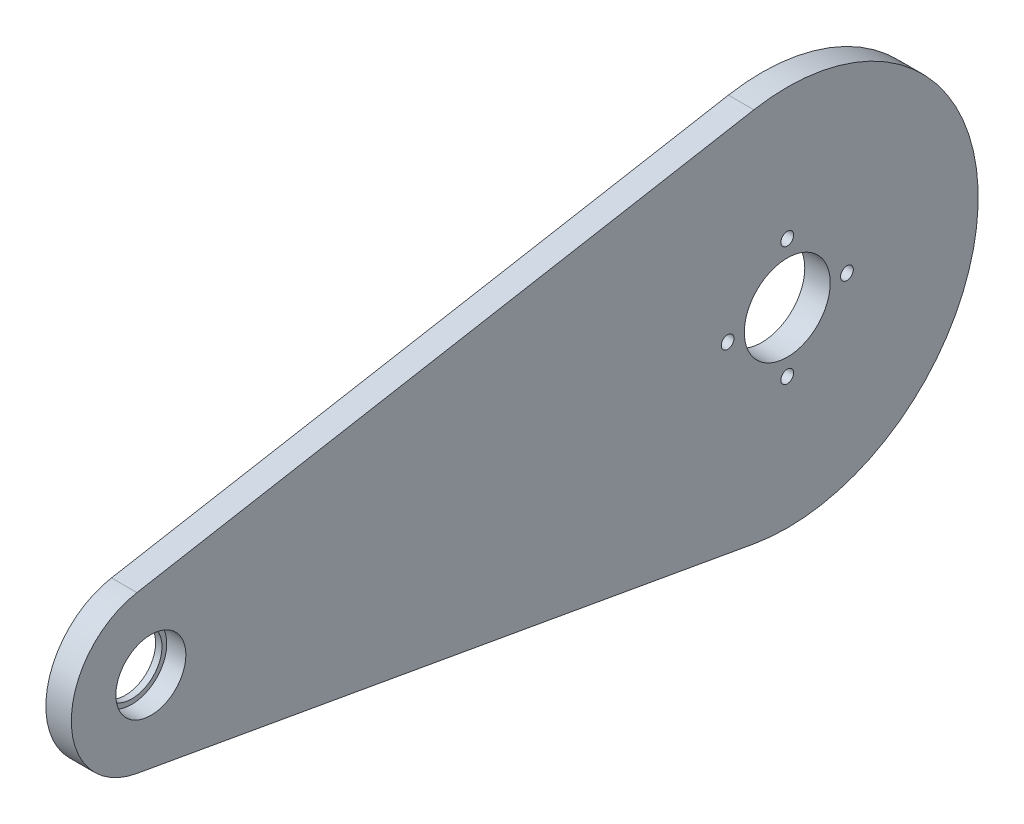
ISO-10303-21;
HEADER;
FILE_DESCRIPTION(('STEP AP214'),'2;1');
FILE_NAME('part.step','',(''),(''),'','','');
FILE_SCHEMA(('AUTOMOTIVE_DESIGN { 1 0 10303 214 1 1 1 1 }'));
ENDSEC;
DATA;
#1=APPLICATION_CONTEXT('core data for automotive mechanical design processes');
#2=APPLICATION_PROTOCOL_DEFINITION('international standard','automotive_design',2000,#1);
#3=PRODUCT_CONTEXT('',#1,'mechanical');
#4=PRODUCT('Part','Part','',(#3));
#5=PRODUCT_RELATED_PRODUCT_CATEGORY('part','',(#4));
#6=PRODUCT_DEFINITION_FORMATION('','',#4);
#7=PRODUCT_DEFINITION_CONTEXT('part definition',#1,'design');
#8=PRODUCT_DEFINITION('design','',#6,#7);
#9=PRODUCT_DEFINITION_SHAPE('','',#8);
#10=(LENGTH_UNIT() NAMED_UNIT(*) SI_UNIT(.MILLI.,.METRE.));
#11=(NAMED_UNIT(*) PLANE_ANGLE_UNIT() SI_UNIT($,.RADIAN.));
#12=(NAMED_UNIT(*) SI_UNIT($,.STERADIAN.) SOLID_ANGLE_UNIT());
#13=UNCERTAINTY_MEASURE_WITH_UNIT(LENGTH_MEASURE(1.E-05),#10,'distance_accuracy_value','');
#14=(GEOMETRIC_REPRESENTATION_CONTEXT(3) GLOBAL_UNCERTAINTY_ASSIGNED_CONTEXT((#13)) GLOBAL_UNIT_ASSIGNED_CONTEXT((#10,
#11,#12)) REPRESENTATION_CONTEXT('',''));
#15=CARTESIAN_POINT('',(0.,0.,0.));
#16=DIRECTION('',(0.,0.,1.));
#17=DIRECTION('',(1.,0.,0.));
#18=AXIS2_PLACEMENT_3D('',#15,#16,#17);
#19=CARTESIAN_POINT('',(4.,0.,200.));
#20=DIRECTION('',(-1.,0.,0.));
#21=DIRECTION('',(0.,0.,1.));
#22=AXIS2_PLACEMENT_3D('',#19,#20,#21);
#23=CYLINDRICAL_SURFACE('',#22,11.);
#24=CARTESIAN_POINT('',(4.,0.,200.));
#25=DIRECTION('',(1.,0.,0.));
#26=DIRECTION('',(0.,0.,-1.));
#27=AXIS2_PLACEMENT_3D('',#24,#25,#26);
#28=CIRCLE('',#27,11.);
#29=CARTESIAN_POINT('',(4.,0.,189.));
#30=VERTEX_POINT('',#29);
#31=EDGE_CURVE('E126',#30,#30,#28,.T.);
#32=ORIENTED_EDGE('',*,*,#31,.T.);
#33=EDGE_LOOP('',(#32));
#34=FACE_BOUND('',#33,.T.);
#35=CARTESIAN_POINT('',(-2.,0.,200.));
#36=DIRECTION('',(-1.,0.,0.));
#37=DIRECTION('',(0.,0.,1.));
#38=AXIS2_PLACEMENT_3D('',#35,#36,#37);
#39=CIRCLE('',#38,11.);
#40=CARTESIAN_POINT('',(-2.,0.,211.));
#41=VERTEX_POINT('',#40);
#42=EDGE_CURVE('E136',#41,#41,#39,.T.);
#43=ORIENTED_EDGE('',*,*,#42,.T.);
#44=EDGE_LOOP('',(#43));
#45=FACE_BOUND('',#44,.T.);
#46=ADVANCED_FACE('F43',(#34,#45),#23,.F.);
#47=CARTESIAN_POINT('',(4.,0.,200.));
#48=DIRECTION('',(1.,0.,0.));
#49=DIRECTION('',(0.,0.,-1.));
#50=AXIS2_PLACEMENT_3D('',#47,#48,#49);
#51=PLANE('',#50);
#52=CARTESIAN_POINT('',(4.,18.75,0.));
#53=DIRECTION('',(1.,0.,0.));
#54=DIRECTION('',(0.,0.,-1.));
#55=AXIS2_PLACEMENT_3D('',#52,#53,#54);
#56=CIRCLE('',#55,2.);
#57=CARTESIAN_POINT('',(4.,18.75,-2.));
#58=VERTEX_POINT('',#57);
#59=EDGE_CURVE('E151',#58,#58,#56,.T.);
#60=ORIENTED_EDGE('',*,*,#59,.F.);
#61=EDGE_LOOP('',(#60));
#62=FACE_BOUND('',#61,.T.);
#63=CARTESIAN_POINT('',(4.,0.,-18.75));
#64=DIRECTION('',(1.,0.,0.));
#65=DIRECTION('',(0.,0.,-1.));
#66=AXIS2_PLACEMENT_3D('',#63,#64,#65);
#67=CIRCLE('',#66,2.);
#68=CARTESIAN_POINT('',(4.,0.,-20.75));
#69=VERTEX_POINT('',#68);
#70=EDGE_CURVE('E148',#69,#69,#67,.T.);
#71=ORIENTED_EDGE('',*,*,#70,.F.);
#72=EDGE_LOOP('',(#71));
#73=FACE_BOUND('',#72,.T.);
#74=CARTESIAN_POINT('',(4.,-18.75,0.));
#75=DIRECTION('',(1.,0.,0.));
#76=DIRECTION('',(0.,0.,-1.));
#77=AXIS2_PLACEMENT_3D('',#74,#75,#76);
#78=CIRCLE('',#77,2.);
#79=CARTESIAN_POINT('',(4.,-18.75,-2.));
#80=VERTEX_POINT('',#79);
#81=EDGE_CURVE('E142',#80,#80,#78,.T.);
#82=ORIENTED_EDGE('',*,*,#81,.F.);
#83=EDGE_LOOP('',(#82));
#84=FACE_BOUND('',#83,.T.);
#85=CARTESIAN_POINT('',(4.,0.,18.75));
#86=DIRECTION('',(1.,0.,0.));
#87=DIRECTION('',(0.,0.,-1.));
#88=AXIS2_PLACEMENT_3D('',#85,#86,#87);
#89=CIRCLE('',#88,2.);
#90=CARTESIAN_POINT('',(4.,0.,16.75));
#91=VERTEX_POINT('',#90);
#92=EDGE_CURVE('E135',#91,#91,#89,.T.);
#93=ORIENTED_EDGE('',*,*,#92,.F.);
#94=EDGE_LOOP('',(#93));
#95=FACE_BOUND('',#94,.T.);
#96=CARTESIAN_POINT('',(4.,0.,0.));
#97=DIRECTION('',(1.,0.,0.));
#98=DIRECTION('',(0.,0.,-1.));
#99=AXIS2_PLACEMENT_3D('',#96,#97,#98);
#100=CIRCLE('',#99,13.5);
#101=CARTESIAN_POINT('',(4.,0.,-13.5));
#102=VERTEX_POINT('',#101);
#103=EDGE_CURVE('E111',#102,#102,#100,.T.);
#104=ORIENTED_EDGE('',*,*,#103,.F.);
#105=EDGE_LOOP('',(#104));
#106=FACE_BOUND('',#105,.T.);
#107=CARTESIAN_POINT('',(4.,0.,200.));
#108=DIRECTION('',(1.,0.,0.));
#109=DIRECTION('',(0.,0.,-1.));
#110=AXIS2_PLACEMENT_3D('',#107,#108,#109);
#111=CIRCLE('',#110,25.);
#112=CARTESIAN_POINT('',(4.,24.614210834394,204.375));
#113=VERTEX_POINT('',#112);
#114=CARTESIAN_POINT('',(4.,-24.614210834394,204.375));
#115=VERTEX_POINT('',#114);
#116=EDGE_CURVE('E96',#113,#115,#111,.T.);
#117=ORIENTED_EDGE('',*,*,#116,.T.);
#118=DIRECTION('',(0.,-0.175,-0.984568433375761));
#119=VECTOR('',#118,1.);
#120=CARTESIAN_POINT('',(4.,-24.614210834394,204.375));
#121=LINE('',#120,#119);
#122=CARTESIAN_POINT('',(4.,-59.0741060025456,10.5));
#123=VERTEX_POINT('',#122);
#124=EDGE_CURVE('E90',#115,#123,#121,.T.);
#125=ORIENTED_EDGE('',*,*,#124,.T.);
#126=CARTESIAN_POINT('',(4.,0.,0.));
#127=DIRECTION('',(1.,0.,0.));
#128=DIRECTION('',(0.,0.,-1.));
#129=AXIS2_PLACEMENT_3D('',#126,#127,#128);
#130=CIRCLE('',#129,60.);
#131=CARTESIAN_POINT('',(4.,59.0741060025456,10.5));
#132=VERTEX_POINT('',#131);
#133=EDGE_CURVE('E94',#123,#132,#130,.T.);
#134=ORIENTED_EDGE('',*,*,#133,.T.);
#135=DIRECTION('',(0.,-0.175,0.984568433375761));
#136=VECTOR('',#135,1.);
#137=CARTESIAN_POINT('',(4.,24.614210834394,204.375));
#138=LINE('',#137,#136);
#139=EDGE_CURVE('E60',#132,#113,#138,.T.);
#140=ORIENTED_EDGE('',*,*,#139,.T.);
#141=EDGE_LOOP('',(#117,#125,#134,#140));
#142=FACE_BOUND('',#141,.T.);
#143=ORIENTED_EDGE('',*,*,#31,.F.);
#144=EDGE_LOOP('',(#143));
#145=FACE_BOUND('',#144,.T.);
#146=ADVANCED_FACE('F91',(#62,#73,#84,#95,#106,#142,#145),#51,.T.);
#147=CARTESIAN_POINT('',(-4.,0.,200.));
#148=DIRECTION('',(1.,0.,0.));
#149=DIRECTION('',(0.,0.,-1.));
#150=AXIS2_PLACEMENT_3D('',#147,#148,#149);
#151=PLANE('',#150);
#152=CARTESIAN_POINT('',(-4.,18.75,0.));
#153=DIRECTION('',(1.,0.,0.));
#154=DIRECTION('',(0.,0.,-1.));
#155=AXIS2_PLACEMENT_3D('',#152,#153,#154);
#156=CIRCLE('',#155,2.);
#157=CARTESIAN_POINT('',(-4.,18.75,-2.));
#158=VERTEX_POINT('',#157);
#159=EDGE_CURVE('E131',#158,#158,#156,.T.);
#160=ORIENTED_EDGE('',*,*,#159,.T.);
#161=EDGE_LOOP('',(#160));
#162=FACE_BOUND('',#161,.T.);
#163=CARTESIAN_POINT('',(-4.,0.,-18.75));
#164=DIRECTION('',(1.,0.,0.));
#165=DIRECTION('',(0.,0.,-1.));
#166=AXIS2_PLACEMENT_3D('',#163,#164,#165);
#167=CIRCLE('',#166,2.);
#168=CARTESIAN_POINT('',(-4.,0.,-20.75));
#169=VERTEX_POINT('',#168);
#170=EDGE_CURVE('E145',#169,#169,#167,.T.);
#171=ORIENTED_EDGE('',*,*,#170,.T.);
#172=EDGE_LOOP('',(#171));
#173=FACE_BOUND('',#172,.T.);
#174=CARTESIAN_POINT('',(-4.,-18.75,0.));
#175=DIRECTION('',(1.,0.,0.));
#176=DIRECTION('',(0.,0.,-1.));
#177=AXIS2_PLACEMENT_3D('',#174,#175,#176);
#178=CIRCLE('',#177,2.);
#179=CARTESIAN_POINT('',(-4.,-18.75,-2.));
#180=VERTEX_POINT('',#179);
#181=EDGE_CURVE('E139',#180,#180,#178,.T.);
#182=ORIENTED_EDGE('',*,*,#181,.T.);
#183=EDGE_LOOP('',(#182));
#184=FACE_BOUND('',#183,.T.);
#185=CARTESIAN_POINT('',(-4.,0.,18.75));
#186=DIRECTION('',(1.,0.,0.));
#187=DIRECTION('',(0.,0.,-1.));
#188=AXIS2_PLACEMENT_3D('',#185,#186,#187);
#189=CIRCLE('',#188,2.);
#190=CARTESIAN_POINT('',(-4.,0.,16.75));
#191=VERTEX_POINT('',#190);
#192=EDGE_CURVE('E132',#191,#191,#189,.T.);
#193=ORIENTED_EDGE('',*,*,#192,.T.);
#194=EDGE_LOOP('',(#193));
#195=FACE_BOUND('',#194,.T.);
#196=CARTESIAN_POINT('',(-4.,0.,200.));
#197=DIRECTION('',(1.,0.,0.));
#198=DIRECTION('',(0.,0.,-1.));
#199=AXIS2_PLACEMENT_3D('',#196,#197,#198);
#200=CIRCLE('',#199,25.);
#201=CARTESIAN_POINT('',(-4.,24.614210834394,204.375));
#202=VERTEX_POINT('',#201);
#203=CARTESIAN_POINT('',(-4.,-24.614210834394,204.375));
#204=VERTEX_POINT('',#203);
#205=EDGE_CURVE('E108',#202,#204,#200,.T.);
#206=ORIENTED_EDGE('',*,*,#205,.F.);
#207=DIRECTION('',(0.,-0.175,0.984568433375761));
#208=VECTOR('',#207,1.);
#209=CARTESIAN_POINT('',(-4.,24.614210834394,204.375));
#210=LINE('',#209,#208);
#211=CARTESIAN_POINT('',(-4.,59.0741060025456,10.5));
#212=VERTEX_POINT('',#211);
#213=EDGE_CURVE('E83',#212,#202,#210,.T.);
#214=ORIENTED_EDGE('',*,*,#213,.F.);
#215=CARTESIAN_POINT('',(-4.,0.,0.));
#216=DIRECTION('',(1.,0.,0.));
#217=DIRECTION('',(0.,0.,-1.));
#218=AXIS2_PLACEMENT_3D('',#215,#216,#217);
#219=CIRCLE('',#218,60.);
#220=CARTESIAN_POINT('',(-4.,-59.0741060025456,10.5));
#221=VERTEX_POINT('',#220);
#222=EDGE_CURVE('E77',#221,#212,#219,.T.);
#223=ORIENTED_EDGE('',*,*,#222,.F.);
#224=DIRECTION('',(0.,-0.175,-0.984568433375761));
#225=VECTOR('',#224,1.);
#226=CARTESIAN_POINT('',(-4.,-24.614210834394,204.375));
#227=LINE('',#226,#225);
#228=EDGE_CURVE('E100',#204,#221,#227,.T.);
#229=ORIENTED_EDGE('',*,*,#228,.F.);
#230=EDGE_LOOP('',(#206,#214,#223,#229));
#231=FACE_BOUND('',#230,.T.);
#232=CARTESIAN_POINT('',(-4.,0.,0.));
#233=DIRECTION('',(1.,0.,0.));
#234=DIRECTION('',(0.,0.,-1.));
#235=AXIS2_PLACEMENT_3D('',#232,#233,#234);
#236=CIRCLE('',#235,13.5);
#237=CARTESIAN_POINT('',(-4.,0.,-13.5));
#238=VERTEX_POINT('',#237);
#239=EDGE_CURVE('E123',#238,#238,#236,.T.);
#240=ORIENTED_EDGE('',*,*,#239,.T.);
#241=EDGE_LOOP('',(#240));
#242=FACE_BOUND('',#241,.T.);
#243=CARTESIAN_POINT('',(-4.,0.,200.));
#244=DIRECTION('',(-1.,0.,0.));
#245=DIRECTION('',(0.,0.,1.));
#246=AXIS2_PLACEMENT_3D('',#243,#244,#245);
#247=CIRCLE('',#246,9.50000000000001);
#248=CARTESIAN_POINT('',(-4.,0.,209.5));
#249=VERTEX_POINT('',#248);
#250=EDGE_CURVE('E159',#249,#249,#247,.T.);
#251=ORIENTED_EDGE('',*,*,#250,.F.);
#252=EDGE_LOOP('',(#251));
#253=FACE_BOUND('',#252,.T.);
#254=ADVANCED_FACE('F119',(#162,#173,#184,#195,#231,#242,#253),#151,.F.);
#255=CARTESIAN_POINT('',(4.,0.,200.));
#256=DIRECTION('',(-1.,0.,0.));
#257=DIRECTION('',(0.,0.,1.));
#258=AXIS2_PLACEMENT_3D('',#255,#256,#257);
#259=CYLINDRICAL_SURFACE('',#258,25.);
#260=ORIENTED_EDGE('',*,*,#205,.T.);
#261=DIRECTION('',(-1.,0.,0.));
#262=VECTOR('',#261,1.);
#263=CARTESIAN_POINT('',(4.,-24.614210834394,204.375));
#264=LINE('',#263,#262);
#265=EDGE_CURVE('E11',#115,#204,#264,.T.);
#266=ORIENTED_EDGE('',*,*,#265,.F.);
#267=ORIENTED_EDGE('',*,*,#116,.F.);
#268=DIRECTION('',(-1.,0.,0.));
#269=VECTOR('',#268,1.);
#270=CARTESIAN_POINT('',(4.,24.614210834394,204.375));
#271=LINE('',#270,#269);
#272=EDGE_CURVE('E104',#113,#202,#271,.T.);
#273=ORIENTED_EDGE('',*,*,#272,.T.);
#274=EDGE_LOOP('',(#260,#266,#267,#273));
#275=FACE_BOUND('',#274,.T.);
#276=ADVANCED_FACE('F45',(#275),#259,.T.);
#277=CARTESIAN_POINT('',(4.,-24.614210834394,204.375));
#278=DIRECTION('',(0.,0.984568433375761,-0.175));
#279=DIRECTION('',(0.,0.175,0.984568433375761));
#280=AXIS2_PLACEMENT_3D('',#277,#278,#279);
#281=PLANE('',#280);
#282=ORIENTED_EDGE('',*,*,#228,.T.);
#283=DIRECTION('',(-1.,0.,0.));
#284=VECTOR('',#283,1.);
#285=CARTESIAN_POINT('',(4.,-59.0741060025456,10.5));
#286=LINE('',#285,#284);
#287=EDGE_CURVE('E52',#123,#221,#286,.T.);
#288=ORIENTED_EDGE('',*,*,#287,.F.);
#289=ORIENTED_EDGE('',*,*,#124,.F.);
#290=ORIENTED_EDGE('',*,*,#265,.T.);
#291=EDGE_LOOP('',(#282,#288,#289,#290));
#292=FACE_BOUND('',#291,.T.);
#293=ADVANCED_FACE('F99',(#292),#281,.F.);
#294=CARTESIAN_POINT('',(4.,0.,0.));
#295=DIRECTION('',(-1.,0.,0.));
#296=DIRECTION('',(0.,0.,1.));
#297=AXIS2_PLACEMENT_3D('',#294,#295,#296);
#298=CYLINDRICAL_SURFACE('',#297,60.);
#299=ORIENTED_EDGE('',*,*,#222,.T.);
#300=DIRECTION('',(-1.,0.,0.));
#301=VECTOR('',#300,1.);
#302=CARTESIAN_POINT('',(4.,59.0741060025456,10.5));
#303=LINE('',#302,#301);
#304=EDGE_CURVE('E101',#132,#212,#303,.T.);
#305=ORIENTED_EDGE('',*,*,#304,.F.);
#306=ORIENTED_EDGE('',*,*,#133,.F.);
#307=ORIENTED_EDGE('',*,*,#287,.T.);
#308=EDGE_LOOP('',(#299,#305,#306,#307));
#309=FACE_BOUND('',#308,.T.);
#310=ADVANCED_FACE('F102',(#309),#298,.T.);
#311=CARTESIAN_POINT('',(4.,24.614210834394,204.375));
#312=DIRECTION('',(0.,-0.984568433375761,-0.175));
#313=DIRECTION('',(0.,0.175,-0.984568433375761));
#314=AXIS2_PLACEMENT_3D('',#311,#312,#313);
#315=PLANE('',#314);
#316=ORIENTED_EDGE('',*,*,#213,.T.);
#317=ORIENTED_EDGE('',*,*,#272,.F.);
#318=ORIENTED_EDGE('',*,*,#139,.F.);
#319=ORIENTED_EDGE('',*,*,#304,.T.);
#320=EDGE_LOOP('',(#316,#317,#318,#319));
#321=FACE_BOUND('',#320,.T.);
#322=ADVANCED_FACE('F116',(#321),#315,.F.);
#323=CARTESIAN_POINT('',(4.,0.,0.));
#324=DIRECTION('',(-1.,0.,0.));
#325=DIRECTION('',(0.,0.,1.));
#326=AXIS2_PLACEMENT_3D('',#323,#324,#325);
#327=CYLINDRICAL_SURFACE('',#326,13.5);
#328=ORIENTED_EDGE('',*,*,#103,.T.);
#329=EDGE_LOOP('',(#328));
#330=FACE_BOUND('',#329,.T.);
#331=ORIENTED_EDGE('',*,*,#239,.F.);
#332=EDGE_LOOP('',(#331));
#333=FACE_BOUND('',#332,.T.);
#334=ADVANCED_FACE('F195',(#330,#333),#327,.F.);
#335=CARTESIAN_POINT('',(-4.,0.,18.75));
#336=DIRECTION('',(1.,0.,0.));
#337=DIRECTION('',(0.,0.,-1.));
#338=AXIS2_PLACEMENT_3D('',#335,#336,#337);
#339=CYLINDRICAL_SURFACE('',#338,2.);
#340=ORIENTED_EDGE('',*,*,#192,.F.);
#341=EDGE_LOOP('',(#340));
#342=FACE_BOUND('',#341,.T.);
#343=ORIENTED_EDGE('',*,*,#92,.T.);
#344=EDGE_LOOP('',(#343));
#345=FACE_BOUND('',#344,.T.);
#346=ADVANCED_FACE('F193',(#342,#345),#339,.F.);
#347=CARTESIAN_POINT('',(-4.,-18.75,0.));
#348=DIRECTION('',(1.,0.,0.));
#349=DIRECTION('',(0.,0.,-1.));
#350=AXIS2_PLACEMENT_3D('',#347,#348,#349);
#351=CYLINDRICAL_SURFACE('',#350,2.);
#352=ORIENTED_EDGE('',*,*,#181,.F.);
#353=EDGE_LOOP('',(#352));
#354=FACE_BOUND('',#353,.T.);
#355=ORIENTED_EDGE('',*,*,#81,.T.);
#356=EDGE_LOOP('',(#355));
#357=FACE_BOUND('',#356,.T.);
#358=ADVANCED_FACE('F202',(#354,#357),#351,.F.);
#359=CARTESIAN_POINT('',(-4.,0.,-18.75));
#360=DIRECTION('',(1.,0.,0.));
#361=DIRECTION('',(0.,0.,-1.));
#362=AXIS2_PLACEMENT_3D('',#359,#360,#361);
#363=CYLINDRICAL_SURFACE('',#362,2.);
#364=ORIENTED_EDGE('',*,*,#170,.F.);
#365=EDGE_LOOP('',(#364));
#366=FACE_BOUND('',#365,.T.);
#367=ORIENTED_EDGE('',*,*,#70,.T.);
#368=EDGE_LOOP('',(#367));
#369=FACE_BOUND('',#368,.T.);
#370=ADVANCED_FACE('F254',(#366,#369),#363,.F.);
#371=CARTESIAN_POINT('',(-4.,18.75,0.));
#372=DIRECTION('',(1.,0.,0.));
#373=DIRECTION('',(0.,0.,-1.));
#374=AXIS2_PLACEMENT_3D('',#371,#372,#373);
#375=CYLINDRICAL_SURFACE('',#374,2.);
#376=ORIENTED_EDGE('',*,*,#159,.F.);
#377=EDGE_LOOP('',(#376));
#378=FACE_BOUND('',#377,.T.);
#379=ORIENTED_EDGE('',*,*,#59,.T.);
#380=EDGE_LOOP('',(#379));
#381=FACE_BOUND('',#380,.T.);
#382=ADVANCED_FACE('F262',(#378,#381),#375,.F.);
#383=CARTESIAN_POINT('',(-2.,0.,200.));
#384=DIRECTION('',(-1.,0.,0.));
#385=DIRECTION('',(0.,0.,1.));
#386=AXIS2_PLACEMENT_3D('',#383,#384,#385);
#387=PLANE('',#386);
#388=CARTESIAN_POINT('',(-2.,0.,200.));
#389=DIRECTION('',(-1.,0.,0.));
#390=DIRECTION('',(0.,0.,1.));
#391=AXIS2_PLACEMENT_3D('',#388,#389,#390);
#392=CIRCLE('',#391,9.50000000000001);
#393=CARTESIAN_POINT('',(-2.,0.,209.5));
#394=VERTEX_POINT('',#393);
#395=EDGE_CURVE('E158',#394,#394,#392,.T.);
#396=ORIENTED_EDGE('',*,*,#395,.T.);
#397=EDGE_LOOP('',(#396));
#398=FACE_BOUND('',#397,.T.);
#399=ORIENTED_EDGE('',*,*,#42,.F.);
#400=EDGE_LOOP('',(#399));
#401=FACE_BOUND('',#400,.T.);
#402=ADVANCED_FACE('F165',(#398,#401),#387,.F.);
#403=CARTESIAN_POINT('',(-2.,0.,200.));
#404=DIRECTION('',(-1.,0.,0.));
#405=DIRECTION('',(0.,0.,1.));
#406=AXIS2_PLACEMENT_3D('',#403,#404,#405);
#407=CYLINDRICAL_SURFACE('',#406,9.50000000000001);
#408=ORIENTED_EDGE('',*,*,#395,.F.);
#409=EDGE_LOOP('',(#408));
#410=FACE_BOUND('',#409,.T.);
#411=ORIENTED_EDGE('',*,*,#250,.T.);
#412=EDGE_LOOP('',(#411));
#413=FACE_BOUND('',#412,.T.);
#414=ADVANCED_FACE('F168',(#410,#413),#407,.F.);
#415=CLOSED_SHELL('',(#46,#146,#254,#276,#293,#310,#322,#334,#346,#358,#370,#382,#402,#414));
#416=MANIFOLD_SOLID_BREP('B2',#415);
#417=ADVANCED_BREP_SHAPE_REPRESENTATION('',(#18,#416),#14);
#418=SHAPE_DEFINITION_REPRESENTATION(#9,#417);
ENDSEC;
END-ISO-10303-21;
